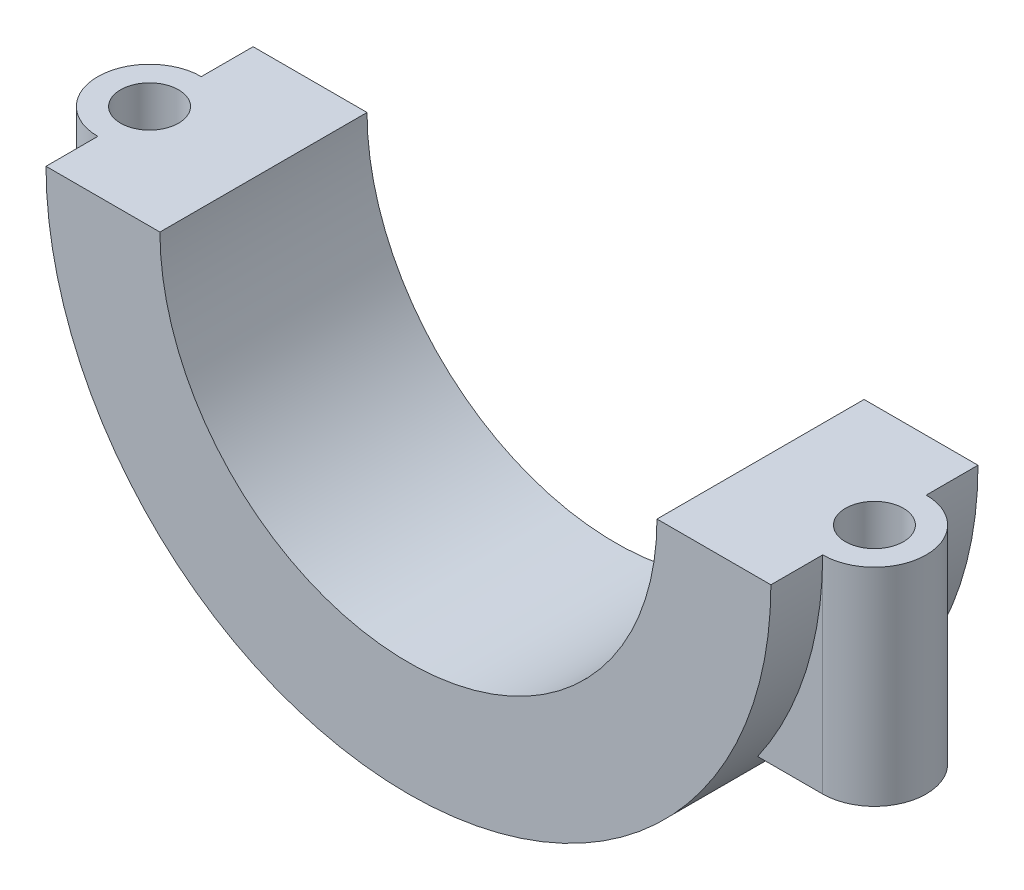
ISO-10303-21;
HEADER;
FILE_DESCRIPTION(('STEP AP214'),'2;1');
FILE_NAME('part.step','',(''),(''),'','','');
FILE_SCHEMA(('AUTOMOTIVE_DESIGN { 1 0 10303 214 1 1 1 1 }'));
ENDSEC;
DATA;
#1=APPLICATION_CONTEXT('core data for automotive mechanical design processes');
#2=APPLICATION_PROTOCOL_DEFINITION('international standard','automotive_design',2000,#1);
#3=PRODUCT_CONTEXT('',#1,'mechanical');
#4=PRODUCT('Part','Part','',(#3));
#5=PRODUCT_RELATED_PRODUCT_CATEGORY('part','',(#4));
#6=PRODUCT_DEFINITION_FORMATION('','',#4);
#7=PRODUCT_DEFINITION_CONTEXT('part definition',#1,'design');
#8=PRODUCT_DEFINITION('design','',#6,#7);
#9=PRODUCT_DEFINITION_SHAPE('','',#8);
#10=(LENGTH_UNIT() NAMED_UNIT(*) SI_UNIT(.MILLI.,.METRE.));
#11=(NAMED_UNIT(*) PLANE_ANGLE_UNIT() SI_UNIT($,.RADIAN.));
#12=(NAMED_UNIT(*) SI_UNIT($,.STERADIAN.) SOLID_ANGLE_UNIT());
#13=UNCERTAINTY_MEASURE_WITH_UNIT(LENGTH_MEASURE(1.E-05),#10,'distance_accuracy_value','');
#14=(GEOMETRIC_REPRESENTATION_CONTEXT(3) GLOBAL_UNCERTAINTY_ASSIGNED_CONTEXT((#13)) GLOBAL_UNIT_ASSIGNED_CONTEXT((#10,
#11,#12)) REPRESENTATION_CONTEXT('',''));
#15=CARTESIAN_POINT('',(0.,0.,0.));
#16=DIRECTION('',(0.,0.,1.));
#17=DIRECTION('',(1.,0.,0.));
#18=AXIS2_PLACEMENT_3D('',#15,#16,#17);
#19=CARTESIAN_POINT('',(26.416,0.,-6.604));
#20=DIRECTION('',(0.,1.,0.));
#21=DIRECTION('',(-1.,0.,0.));
#22=AXIS2_PLACEMENT_3D('',#19,#20,#21);
#23=PLANE('',#22);
#24=CARTESIAN_POINT('',(22.225,0.,0.));
#25=DIRECTION('',(0.,1.,0.));
#26=DIRECTION('',(0.,0.,1.));
#27=AXIS2_PLACEMENT_3D('',#24,#25,#26);
#28=CIRCLE('',#27,1.77799999999999);
#29=CARTESIAN_POINT('',(22.225,0.,1.77799999999999));
#30=VERTEX_POINT('',#29);
#31=EDGE_CURVE('E475',#30,#30,#28,.T.);
#32=ORIENTED_EDGE('',*,*,#31,.F.);
#33=EDGE_LOOP('',(#32));
#34=FACE_BOUND('',#33,.T.);
#35=DIRECTION('',(0.,0.,-1.));
#36=VECTOR('',#35,1.);
#37=CARTESIAN_POINT('',(15.24,0.,-6.3500000000001));
#38=LINE('',#37,#36);
#39=CARTESIAN_POINT('',(15.24,-2.29832177776226E-12,6.3499999999997));
#40=VERTEX_POINT('',#39);
#41=CARTESIAN_POINT('',(15.24,0.,-6.3500000000001));
#42=VERTEX_POINT('',#41);
#43=EDGE_CURVE('E56',#40,#42,#38,.T.);
#44=ORIENTED_EDGE('',*,*,#43,.F.);
#45=DIRECTION('',(-1.,0.,0.));
#46=VECTOR('',#45,1.);
#47=CARTESIAN_POINT('',(-22.225,-2.29832177776226E-12,6.3499999999997));
#48=LINE('',#47,#46);
#49=CARTESIAN_POINT('',(22.225,-2.29832177776226E-12,6.3499999999997));
#50=VERTEX_POINT('',#49);
#51=EDGE_CURVE('E258',#50,#40,#48,.T.);
#52=ORIENTED_EDGE('',*,*,#51,.F.);
#53=DIRECTION('',(0.,0.,-1.));
#54=VECTOR('',#53,1.);
#55=CARTESIAN_POINT('',(22.225,-2.29832177776226E-12,6.3499999999997));
#56=LINE('',#55,#54);
#57=CARTESIAN_POINT('',(22.2249999999997,0.,3.1749999999999));
#58=VERTEX_POINT('',#57);
#59=EDGE_CURVE('E64',#50,#58,#56,.T.);
#60=ORIENTED_EDGE('',*,*,#59,.T.);
#61=CARTESIAN_POINT('',(22.225,0.,0.));
#62=DIRECTION('',(0.,-1.,0.));
#63=DIRECTION('',(0.,0.,-1.));
#64=AXIS2_PLACEMENT_3D('',#61,#62,#63);
#65=CIRCLE('',#64,3.175);
#66=CARTESIAN_POINT('',(22.225,0.,-3.175));
#67=VERTEX_POINT('',#66);
#68=EDGE_CURVE('E48',#58,#67,#65,.F.);
#69=ORIENTED_EDGE('',*,*,#68,.T.);
#70=DIRECTION('',(0.,0.,1.));
#71=VECTOR('',#70,1.);
#72=CARTESIAN_POINT('',(22.225,0.,-6.3500000000001));
#73=LINE('',#72,#71);
#74=CARTESIAN_POINT('',(22.225,0.,-6.3500000000001));
#75=VERTEX_POINT('',#74);
#76=EDGE_CURVE('E279',#75,#67,#73,.T.);
#77=ORIENTED_EDGE('',*,*,#76,.F.);
#78=DIRECTION('',(1.,0.,0.));
#79=VECTOR('',#78,1.);
#80=CARTESIAN_POINT('',(22.225,0.,-6.3500000000001));
#81=LINE('',#80,#79);
#82=EDGE_CURVE('E281',#42,#75,#81,.T.);
#83=ORIENTED_EDGE('',*,*,#82,.F.);
#84=EDGE_LOOP('',(#44,#52,#60,#69,#77,#83));
#85=FACE_BOUND('',#84,.T.);
#86=ADVANCED_FACE('F39',(#34,#85),#23,.T.);
#87=CARTESIAN_POINT('',(-22.30472027194,0.254,-3.175));
#88=DIRECTION('',(0.,0.,-1.));
#89=DIRECTION('',(1.,0.,0.));
#90=AXIS2_PLACEMENT_3D('',#87,#88,#89);
#91=PLANE('',#90);
#92=DIRECTION('',(0.,1.,0.));
#93=VECTOR('',#92,1.);
#94=CARTESIAN_POINT('',(-22.2249999999952,-6.35,-3.175));
#95=LINE('',#94,#93);
#96=CARTESIAN_POINT('',(-22.2249999999976,-12.6999999999998,-3.175));
#97=VERTEX_POINT('',#96);
#98=CARTESIAN_POINT('',(-22.2249999999976,-2.29832177776226E-12,-3.1749999999998));
#99=VERTEX_POINT('',#98);
#100=EDGE_CURVE('E104',#97,#99,#95,.T.);
#101=ORIENTED_EDGE('',*,*,#100,.T.);
#102=CARTESIAN_POINT('',(0.,0.,-3.175));
#103=DIRECTION('',(0.,0.,-1.));
#104=DIRECTION('',(1.,0.,0.));
#105=AXIS2_PLACEMENT_3D('',#102,#103,#104);
#106=CIRCLE('',#105,22.225);
#107=CARTESIAN_POINT('',(-18.2389864027582,-12.7,-3.175));
#108=VERTEX_POINT('',#107);
#109=EDGE_CURVE('E107',#108,#99,#106,.T.);
#110=ORIENTED_EDGE('',*,*,#109,.F.);
#111=DIRECTION('',(-1.,0.,0.));
#112=VECTOR('',#111,1.);
#113=CARTESIAN_POINT('',(-20.231993201375,-12.7,-3.175));
#114=LINE('',#113,#112);
#115=EDGE_CURVE('E91',#108,#97,#114,.T.);
#116=ORIENTED_EDGE('',*,*,#115,.T.);
#117=EDGE_LOOP('',(#101,#110,#116));
#118=FACE_BOUND('',#117,.T.);
#119=ADVANCED_FACE('F103',(#118),#91,.T.);
#120=DIRECTION('',(-1.,0.,0.));
#121=VECTOR('',#120,1.);
#122=CARTESIAN_POINT('',(20.231993201375,-12.7,-3.175));
#123=LINE('',#122,#121);
#124=CARTESIAN_POINT('',(22.225,-12.6999999999998,-3.175));
#125=VERTEX_POINT('',#124);
#126=CARTESIAN_POINT('',(18.2389864027558,-12.7000000000034,-3.175));
#127=VERTEX_POINT('',#126);
#128=EDGE_CURVE('E110',#125,#127,#123,.T.);
#129=ORIENTED_EDGE('',*,*,#128,.T.);
#130=EDGE_CURVE('E202',#67,#127,#106,.T.);
#131=ORIENTED_EDGE('',*,*,#130,.F.);
#132=DIRECTION('',(0.,-1.,0.));
#133=VECTOR('',#132,1.);
#134=CARTESIAN_POINT('',(22.225,-6.35,-3.175));
#135=LINE('',#134,#133);
#136=EDGE_CURVE('E116',#67,#125,#135,.T.);
#137=ORIENTED_EDGE('',*,*,#136,.T.);
#138=EDGE_LOOP('',(#129,#131,#137));
#139=FACE_BOUND('',#138,.T.);
#140=ADVANCED_FACE('F199',(#139),#91,.T.);
#141=CARTESIAN_POINT('',(22.30472027194,0.254,3.175));
#142=DIRECTION('',(0.,0.,1.));
#143=DIRECTION('',(-1.,0.,0.));
#144=AXIS2_PLACEMENT_3D('',#141,#142,#143);
#145=PLANE('',#144);
#146=DIRECTION('',(0.,1.,0.));
#147=VECTOR('',#146,1.);
#148=CARTESIAN_POINT('',(22.2249999999993,-6.35,3.175));
#149=LINE('',#148,#147);
#150=CARTESIAN_POINT('',(22.2249999999997,-12.6999999999998,3.175));
#151=VERTEX_POINT('',#150);
#152=EDGE_CURVE('E161',#151,#58,#149,.T.);
#153=ORIENTED_EDGE('',*,*,#152,.T.);
#154=CARTESIAN_POINT('',(0.,-2.29832177776226E-12,3.175));
#155=DIRECTION('',(0.,0.,1.));
#156=DIRECTION('',(-1.,0.,0.));
#157=AXIS2_PLACEMENT_3D('',#154,#155,#156);
#158=CIRCLE('',#157,22.225);
#159=CARTESIAN_POINT('',(18.2389864027598,-12.7,3.175));
#160=VERTEX_POINT('',#159);
#161=EDGE_CURVE('E213',#160,#58,#158,.T.);
#162=ORIENTED_EDGE('',*,*,#161,.F.);
#163=DIRECTION('',(-1.,0.,0.));
#164=VECTOR('',#163,1.);
#165=CARTESIAN_POINT('',(21.819493201375,-12.7,3.175));
#166=LINE('',#165,#164);
#167=EDGE_CURVE('E186',#151,#160,#166,.T.);
#168=ORIENTED_EDGE('',*,*,#167,.F.);
#169=EDGE_LOOP('',(#153,#162,#168));
#170=FACE_BOUND('',#169,.T.);
#171=ADVANCED_FACE('F274',(#170),#145,.T.);
#172=DIRECTION('',(1.,0.,0.));
#173=VECTOR('',#172,1.);
#174=CARTESIAN_POINT('',(-20.231993201375,-12.7,3.175));
#175=LINE('',#174,#173);
#176=CARTESIAN_POINT('',(-22.225,-12.6999999999998,3.175));
#177=VERTEX_POINT('',#176);
#178=CARTESIAN_POINT('',(-18.2389864027593,-12.7000000000007,3.175));
#179=VERTEX_POINT('',#178);
#180=EDGE_CURVE('E93',#177,#179,#175,.T.);
#181=ORIENTED_EDGE('',*,*,#180,.T.);
#182=CARTESIAN_POINT('',(-22.225,-2.29832177776226E-12,3.175));
#183=VERTEX_POINT('',#182);
#184=EDGE_CURVE('E222',#183,#179,#158,.T.);
#185=ORIENTED_EDGE('',*,*,#184,.F.);
#186=DIRECTION('',(0.,-1.,0.));
#187=VECTOR('',#186,1.);
#188=CARTESIAN_POINT('',(-22.225,-6.35,3.175));
#189=LINE('',#188,#187);
#190=EDGE_CURVE('E98',#183,#177,#189,.T.);
#191=ORIENTED_EDGE('',*,*,#190,.T.);
#192=EDGE_LOOP('',(#181,#185,#191));
#193=FACE_BOUND('',#192,.T.);
#194=ADVANCED_FACE('F354',(#193),#145,.T.);
#195=CARTESIAN_POINT('',(0.,0.,-6.34999999999999));
#196=DIRECTION('',(0.,0.,1.));
#197=DIRECTION('',(1.,0.,0.));
#198=AXIS2_PLACEMENT_3D('',#195,#196,#197);
#199=CYLINDRICAL_SURFACE('',#198,22.225);
#200=DIRECTION('',(0.,0.,-1.));
#201=VECTOR('',#200,1.);
#202=CARTESIAN_POINT('',(18.2389864027534,-12.7000000000069,0.));
#203=LINE('',#202,#201);
#204=EDGE_CURVE('E158',#160,#127,#203,.T.);
#205=ORIENTED_EDGE('',*,*,#204,.F.);
#206=ORIENTED_EDGE('',*,*,#161,.T.);
#207=ORIENTED_EDGE('',*,*,#59,.F.);
#208=CARTESIAN_POINT('',(0.,-2.29832177776226E-12,6.3499999999997));
#209=DIRECTION('',(0.,0.,1.));
#210=DIRECTION('',(-1.,0.,0.));
#211=AXIS2_PLACEMENT_3D('',#208,#209,#210);
#212=CIRCLE('',#211,22.225);
#213=CARTESIAN_POINT('',(-22.225,-2.29832177776226E-12,6.3499999999997));
#214=VERTEX_POINT('',#213);
#215=EDGE_CURVE('E263',#214,#50,#212,.T.);
#216=ORIENTED_EDGE('',*,*,#215,.F.);
#217=DIRECTION('',(0.,0.,-1.));
#218=VECTOR('',#217,1.);
#219=CARTESIAN_POINT('',(-22.225,-2.29832177776226E-12,6.3499999999997));
#220=LINE('',#219,#218);
#221=EDGE_CURVE('E261',#214,#183,#220,.T.);
#222=ORIENTED_EDGE('',*,*,#221,.T.);
#223=ORIENTED_EDGE('',*,*,#184,.T.);
#224=DIRECTION('',(0.,0.,1.));
#225=VECTOR('',#224,1.);
#226=CARTESIAN_POINT('',(-18.2389864027583,-12.7,0.));
#227=LINE('',#226,#225);
#228=EDGE_CURVE('E127',#108,#179,#227,.T.);
#229=ORIENTED_EDGE('',*,*,#228,.F.);
#230=ORIENTED_EDGE('',*,*,#109,.T.);
#231=DIRECTION('',(0.,0.,1.));
#232=VECTOR('',#231,1.);
#233=CARTESIAN_POINT('',(-22.225,0.,-6.3500000000001));
#234=LINE('',#233,#232);
#235=CARTESIAN_POINT('',(-22.225,0.,-6.3500000000001));
#236=VERTEX_POINT('',#235);
#237=EDGE_CURVE('E282',#236,#99,#234,.T.);
#238=ORIENTED_EDGE('',*,*,#237,.F.);
#239=CARTESIAN_POINT('',(0.,0.,-6.3500000000001));
#240=DIRECTION('',(0.,0.,-1.));
#241=DIRECTION('',(1.,0.,0.));
#242=AXIS2_PLACEMENT_3D('',#239,#240,#241);
#243=CIRCLE('',#242,22.225);
#244=EDGE_CURVE('E287',#75,#236,#243,.T.);
#245=ORIENTED_EDGE('',*,*,#244,.F.);
#246=ORIENTED_EDGE('',*,*,#76,.T.);
#247=ORIENTED_EDGE('',*,*,#130,.T.);
#248=EDGE_LOOP('',(#205,#206,#207,#216,#222,#223,#229,#230,#238,#245,#246,#247));
#249=FACE_BOUND('',#248,.T.);
#250=ADVANCED_FACE('F211',(#249),#199,.T.);
#251=CARTESIAN_POINT('',(-22.225,0.,0.));
#252=DIRECTION('',(0.,1.,0.));
#253=DIRECTION('',(0.,0.,1.));
#254=AXIS2_PLACEMENT_3D('',#251,#252,#253);
#255=CIRCLE('',#254,1.77799999999999);
#256=CARTESIAN_POINT('',(-22.225,0.,1.77799999999999));
#257=VERTEX_POINT('',#256);
#258=EDGE_CURVE('E480',#257,#257,#255,.T.);
#259=ORIENTED_EDGE('',*,*,#258,.F.);
#260=EDGE_LOOP('',(#259));
#261=FACE_BOUND('',#260,.T.);
#262=DIRECTION('',(0.,0.,-1.));
#263=VECTOR('',#262,1.);
#264=CARTESIAN_POINT('',(-15.24,0.,-6.3500000000001));
#265=LINE('',#264,#263);
#266=CARTESIAN_POINT('',(-15.24,0.,-6.3500000000001));
#267=VERTEX_POINT('',#266);
#268=CARTESIAN_POINT('',(-15.24,0.,6.3499999999997));
#269=VERTEX_POINT('',#268);
#270=EDGE_CURVE('E244',#267,#269,#265,.F.);
#271=ORIENTED_EDGE('',*,*,#270,.F.);
#272=EDGE_CURVE('E283',#236,#267,#81,.T.);
#273=ORIENTED_EDGE('',*,*,#272,.F.);
#274=ORIENTED_EDGE('',*,*,#237,.T.);
#275=CARTESIAN_POINT('',(-22.225,0.,0.));
#276=DIRECTION('',(0.,-1.,0.));
#277=DIRECTION('',(0.,0.,-1.));
#278=AXIS2_PLACEMENT_3D('',#275,#276,#277);
#279=CIRCLE('',#278,3.175);
#280=EDGE_CURVE('E114',#99,#183,#279,.F.);
#281=ORIENTED_EDGE('',*,*,#280,.T.);
#282=ORIENTED_EDGE('',*,*,#221,.F.);
#283=EDGE_CURVE('E256',#269,#214,#48,.T.);
#284=ORIENTED_EDGE('',*,*,#283,.F.);
#285=EDGE_LOOP('',(#271,#273,#274,#281,#282,#284));
#286=FACE_BOUND('',#285,.T.);
#287=ADVANCED_FACE('F41',(#261,#286),#23,.T.);
#288=CARTESIAN_POINT('',(-22.225,0.,0.));
#289=DIRECTION('',(0.,-1.,0.));
#290=DIRECTION('',(0.,0.,-1.));
#291=AXIS2_PLACEMENT_3D('',#288,#289,#290);
#292=CYLINDRICAL_SURFACE('',#291,3.175);
#293=CARTESIAN_POINT('',(-22.225,-12.6999999999996,0.));
#294=DIRECTION('',(0.,-1.,0.));
#295=DIRECTION('',(0.,0.,-1.));
#296=AXIS2_PLACEMENT_3D('',#293,#294,#295);
#297=CIRCLE('',#296,3.175);
#298=EDGE_CURVE('E86',#177,#97,#297,.T.);
#299=ORIENTED_EDGE('',*,*,#298,.F.);
#300=ORIENTED_EDGE('',*,*,#190,.F.);
#301=ORIENTED_EDGE('',*,*,#280,.F.);
#302=ORIENTED_EDGE('',*,*,#100,.F.);
#303=EDGE_LOOP('',(#299,#300,#301,#302));
#304=FACE_BOUND('',#303,.T.);
#305=ADVANCED_FACE('F112',(#304),#292,.T.);
#306=CARTESIAN_POINT('',(-18.09576613081,-12.7,-3.302));
#307=DIRECTION('',(0.,-1.,0.));
#308=DIRECTION('',(0.,0.,1.));
#309=AXIS2_PLACEMENT_3D('',#306,#307,#308);
#310=PLANE('',#309);
#311=CARTESIAN_POINT('',(-22.225,-12.7,0.));
#312=DIRECTION('',(0.,-1.,0.));
#313=DIRECTION('',(0.,0.,-1.));
#314=AXIS2_PLACEMENT_3D('',#311,#312,#313);
#315=CIRCLE('',#314,1.77799999999999);
#316=CARTESIAN_POINT('',(-22.225,-12.7,-1.77799999999999));
#317=VERTEX_POINT('',#316);
#318=EDGE_CURVE('E43',#317,#317,#315,.T.);
#319=ORIENTED_EDGE('',*,*,#318,.F.);
#320=EDGE_LOOP('',(#319));
#321=FACE_BOUND('',#320,.T.);
#322=ORIENTED_EDGE('',*,*,#298,.T.);
#323=ORIENTED_EDGE('',*,*,#115,.F.);
#324=ORIENTED_EDGE('',*,*,#228,.T.);
#325=ORIENTED_EDGE('',*,*,#180,.F.);
#326=EDGE_LOOP('',(#322,#323,#324,#325));
#327=FACE_BOUND('',#326,.T.);
#328=ADVANCED_FACE('F88',(#321,#327),#310,.T.);
#329=CARTESIAN_POINT('',(18.09576613081,-12.7,3.302));
#330=DIRECTION('',(0.,-1.,0.));
#331=DIRECTION('',(0.,0.,-1.));
#332=AXIS2_PLACEMENT_3D('',#329,#330,#331);
#333=PLANE('',#332);
#334=CARTESIAN_POINT('',(22.225,-12.7,0.));
#335=DIRECTION('',(0.,-1.,0.));
#336=DIRECTION('',(0.,0.,-1.));
#337=AXIS2_PLACEMENT_3D('',#334,#335,#336);
#338=CIRCLE('',#337,1.77799999999999);
#339=CARTESIAN_POINT('',(22.225,-12.7,-1.77799999999999));
#340=VERTEX_POINT('',#339);
#341=EDGE_CURVE('E259',#340,#340,#338,.T.);
#342=ORIENTED_EDGE('',*,*,#341,.F.);
#343=EDGE_LOOP('',(#342));
#344=FACE_BOUND('',#343,.T.);
#345=CARTESIAN_POINT('',(22.225,-12.6999999999996,0.));
#346=DIRECTION('',(0.,-1.,0.));
#347=DIRECTION('',(0.,0.,-1.));
#348=AXIS2_PLACEMENT_3D('',#345,#346,#347);
#349=CIRCLE('',#348,3.175);
#350=EDGE_CURVE('E121',#125,#151,#349,.T.);
#351=ORIENTED_EDGE('',*,*,#350,.T.);
#352=ORIENTED_EDGE('',*,*,#167,.T.);
#353=ORIENTED_EDGE('',*,*,#204,.T.);
#354=ORIENTED_EDGE('',*,*,#128,.F.);
#355=EDGE_LOOP('',(#351,#352,#353,#354));
#356=FACE_BOUND('',#355,.T.);
#357=ADVANCED_FACE('F209',(#344,#356),#333,.T.);
#358=CARTESIAN_POINT('',(22.225,0.,0.));
#359=DIRECTION('',(0.,-1.,0.));
#360=DIRECTION('',(0.,0.,-1.));
#361=AXIS2_PLACEMENT_3D('',#358,#359,#360);
#362=CYLINDRICAL_SURFACE('',#361,3.175);
#363=ORIENTED_EDGE('',*,*,#350,.F.);
#364=ORIENTED_EDGE('',*,*,#136,.F.);
#365=ORIENTED_EDGE('',*,*,#68,.F.);
#366=ORIENTED_EDGE('',*,*,#152,.F.);
#367=EDGE_LOOP('',(#363,#364,#365,#366));
#368=FACE_BOUND('',#367,.T.);
#369=ADVANCED_FACE('F276',(#368),#362,.T.);
#370=CARTESIAN_POINT('',(0.,-2.29832177776226E-12,6.3499999999997));
#371=DIRECTION('',(0.,0.,-1.));
#372=DIRECTION('',(-1.,0.,0.));
#373=AXIS2_PLACEMENT_3D('',#370,#371,#372);
#374=PLANE('',#373);
#375=ORIENTED_EDGE('',*,*,#51,.T.);
#376=CARTESIAN_POINT('',(0.,0.,6.3499999999997));
#377=DIRECTION('',(0.,0.,-1.));
#378=DIRECTION('',(-1.,0.,0.));
#379=AXIS2_PLACEMENT_3D('',#376,#377,#378);
#380=CIRCLE('',#379,15.24);
#381=EDGE_CURVE('E247',#40,#269,#380,.T.);
#382=ORIENTED_EDGE('',*,*,#381,.T.);
#383=ORIENTED_EDGE('',*,*,#283,.T.);
#384=ORIENTED_EDGE('',*,*,#215,.T.);
#385=EDGE_LOOP('',(#375,#382,#383,#384));
#386=FACE_BOUND('',#385,.T.);
#387=ADVANCED_FACE('F254',(#386),#374,.F.);
#388=CARTESIAN_POINT('',(0.,0.,-6.3500000000001));
#389=DIRECTION('',(0.,0.,1.));
#390=DIRECTION('',(1.,0.,0.));
#391=AXIS2_PLACEMENT_3D('',#388,#389,#390);
#392=PLANE('',#391);
#393=ORIENTED_EDGE('',*,*,#272,.T.);
#394=CARTESIAN_POINT('',(0.,0.,-6.3500000000001));
#395=DIRECTION('',(0.,0.,1.));
#396=DIRECTION('',(1.,0.,0.));
#397=AXIS2_PLACEMENT_3D('',#394,#395,#396);
#398=CIRCLE('',#397,15.24);
#399=EDGE_CURVE('E12',#267,#42,#398,.T.);
#400=ORIENTED_EDGE('',*,*,#399,.T.);
#401=ORIENTED_EDGE('',*,*,#82,.T.);
#402=ORIENTED_EDGE('',*,*,#244,.T.);
#403=EDGE_LOOP('',(#393,#400,#401,#402));
#404=FACE_BOUND('',#403,.T.);
#405=ADVANCED_FACE('F419',(#404),#392,.F.);
#406=CARTESIAN_POINT('',(0.,0.,-6.3500000000001));
#407=DIRECTION('',(0.,0.,-1.));
#408=DIRECTION('',(-1.,0.,0.));
#409=AXIS2_PLACEMENT_3D('',#406,#407,#408);
#410=CYLINDRICAL_SURFACE('',#409,15.24);
#411=ORIENTED_EDGE('',*,*,#43,.T.);
#412=ORIENTED_EDGE('',*,*,#399,.F.);
#413=ORIENTED_EDGE('',*,*,#270,.T.);
#414=ORIENTED_EDGE('',*,*,#381,.F.);
#415=EDGE_LOOP('',(#411,#412,#413,#414));
#416=FACE_BOUND('',#415,.T.);
#417=ADVANCED_FACE('F246',(#416),#410,.F.);
#418=CARTESIAN_POINT('',(22.225,0.,0.));
#419=DIRECTION('',(0.,1.,0.));
#420=DIRECTION('',(0.,0.,1.));
#421=AXIS2_PLACEMENT_3D('',#418,#419,#420);
#422=CYLINDRICAL_SURFACE('',#421,1.77799999999999);
#423=ORIENTED_EDGE('',*,*,#341,.T.);
#424=EDGE_LOOP('',(#423));
#425=FACE_BOUND('',#424,.T.);
#426=ORIENTED_EDGE('',*,*,#31,.T.);
#427=EDGE_LOOP('',(#426));
#428=FACE_BOUND('',#427,.T.);
#429=ADVANCED_FACE('F431',(#425,#428),#422,.F.);
#430=CARTESIAN_POINT('',(-22.225,0.,0.));
#431=DIRECTION('',(0.,1.,0.));
#432=DIRECTION('',(0.,0.,1.));
#433=AXIS2_PLACEMENT_3D('',#430,#431,#432);
#434=CYLINDRICAL_SURFACE('',#433,1.77799999999999);
#435=ORIENTED_EDGE('',*,*,#318,.T.);
#436=EDGE_LOOP('',(#435));
#437=FACE_BOUND('',#436,.T.);
#438=ORIENTED_EDGE('',*,*,#258,.T.);
#439=EDGE_LOOP('',(#438));
#440=FACE_BOUND('',#439,.T.);
#441=ADVANCED_FACE('F437',(#437,#440),#434,.F.);
#442=CLOSED_SHELL('',(#86,#119,#140,#171,#194,#250,#287,#305,#328,#357,#369,#387,#405,#417,#429,#441));
#443=MANIFOLD_SOLID_BREP('B2',#442);
#444=ADVANCED_BREP_SHAPE_REPRESENTATION('',(#18,#443),#14);
#445=SHAPE_DEFINITION_REPRESENTATION(#9,#444);
ENDSEC;
END-ISO-10303-21;
